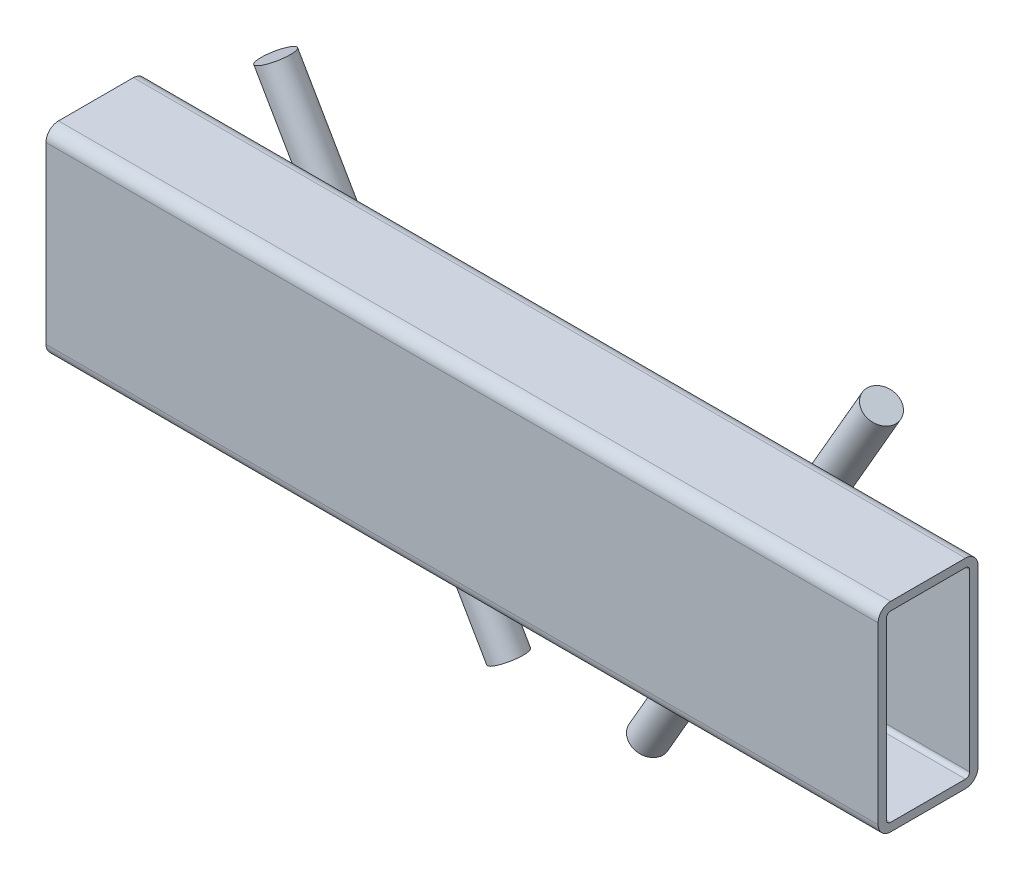
ISO-10303-21;
HEADER;
FILE_DESCRIPTION(('STEP AP214'),'2;1');
FILE_NAME('part.step','',(''),(''),'','','');
FILE_SCHEMA(('AUTOMOTIVE_DESIGN { 1 0 10303 214 1 1 1 1 }'));
ENDSEC;
DATA;
#1=APPLICATION_CONTEXT('core data for automotive mechanical design processes');
#2=APPLICATION_PROTOCOL_DEFINITION('international standard','automotive_design',2000,#1);
#3=PRODUCT_CONTEXT('',#1,'mechanical');
#4=PRODUCT('Part','Part','',(#3));
#5=PRODUCT_RELATED_PRODUCT_CATEGORY('part','',(#4));
#6=PRODUCT_DEFINITION_FORMATION('','',#4);
#7=PRODUCT_DEFINITION_CONTEXT('part definition',#1,'design');
#8=PRODUCT_DEFINITION('design','',#6,#7);
#9=PRODUCT_DEFINITION_SHAPE('','',#8);
#10=(LENGTH_UNIT() NAMED_UNIT(*) SI_UNIT(.MILLI.,.METRE.));
#11=(NAMED_UNIT(*) PLANE_ANGLE_UNIT() SI_UNIT($,.RADIAN.));
#12=(NAMED_UNIT(*) SI_UNIT($,.STERADIAN.) SOLID_ANGLE_UNIT());
#13=UNCERTAINTY_MEASURE_WITH_UNIT(LENGTH_MEASURE(1.E-05),#10,'distance_accuracy_value','');
#14=(GEOMETRIC_REPRESENTATION_CONTEXT(3) GLOBAL_UNCERTAINTY_ASSIGNED_CONTEXT((#13)) GLOBAL_UNIT_ASSIGNED_CONTEXT((#10,
#11,#12)) REPRESENTATION_CONTEXT('',''));
#15=CARTESIAN_POINT('',(0.,0.,0.));
#16=DIRECTION('',(0.,0.,1.));
#17=DIRECTION('',(1.,0.,0.));
#18=AXIS2_PLACEMENT_3D('',#15,#16,#17);
#19=CARTESIAN_POINT('',(21.,-73.,-20.));
#20=DIRECTION('',(0.5,0.86602540378444,0.));
#21=DIRECTION('',(0.86602540378444,-0.500000000000001,0.));
#22=AXIS2_PLACEMENT_3D('',#19,#20,#21);
#23=PLANE('',#22);
#24=CARTESIAN_POINT('',(21.,-73.,-20.));
#25=DIRECTION('',(-0.5,-0.86602540378444,0.));
#26=DIRECTION('',(0.86602540378444,-0.500000000000001,0.));
#27=AXIS2_PLACEMENT_3D('',#24,#25,#26);
#28=CIRCLE('',#27,5.);
#29=CARTESIAN_POINT('',(25.3301270189221,-75.5000000000001,-20.));
#30=VERTEX_POINT('',#29);
#31=EDGE_CURVE('E96',#30,#30,#28,.T.);
#32=ORIENTED_EDGE('',*,*,#31,.T.);
#33=EDGE_LOOP('',(#32));
#34=FACE_BOUND('',#33,.T.);
#35=ADVANCED_FACE('F89',(#34),#23,.F.);
#36=CARTESIAN_POINT('',(91.0000000000001,48.2435565298214,-20.));
#37=DIRECTION('',(0.5,0.86602540378444,0.));
#38=DIRECTION('',(0.86602540378444,-0.500000000000001,0.));
#39=AXIS2_PLACEMENT_3D('',#36,#37,#38);
#40=PLANE('',#39);
#41=CARTESIAN_POINT('',(91.0000000000001,48.2435565298214,-20.));
#42=DIRECTION('',(-0.5,-0.86602540378444,0.));
#43=DIRECTION('',(0.86602540378444,-0.500000000000001,0.));
#44=AXIS2_PLACEMENT_3D('',#41,#42,#43);
#45=CIRCLE('',#44,5.);
#46=CARTESIAN_POINT('',(95.3301270189223,45.7435565298214,-20.));
#47=VERTEX_POINT('',#46);
#48=EDGE_CURVE('E15',#47,#47,#45,.T.);
#49=ORIENTED_EDGE('',*,*,#48,.F.);
#50=EDGE_LOOP('',(#49));
#51=FACE_BOUND('',#50,.T.);
#52=ADVANCED_FACE('F106',(#51),#40,.T.);
#53=CARTESIAN_POINT('',(21.,-73.,-20.));
#54=DIRECTION('',(0.5,0.86602540378444,0.));
#55=DIRECTION('',(0.86602540378444,-0.500000000000001,0.));
#56=AXIS2_PLACEMENT_3D('',#53,#54,#55);
#57=CYLINDRICAL_SURFACE('',#56,5.);
#58=ORIENTED_EDGE('',*,*,#48,.T.);
#59=EDGE_LOOP('',(#58));
#60=FACE_BOUND('',#59,.T.);
#61=ORIENTED_EDGE('',*,*,#31,.F.);
#62=EDGE_LOOP('',(#61));
#63=FACE_BOUND('',#62,.T.);
#64=ADVANCED_FACE('F103',(#60,#63),#57,.T.);
#65=CLOSED_SHELL('',(#35,#52,#64));
#66=MANIFOLD_SOLID_BREP('B2',#65);
#67=CARTESIAN_POINT('',(-21.,-73.,-20.));
#68=DIRECTION('',(-0.500000000000001,0.86602540378444,0.));
#69=DIRECTION('',(-0.86602540378444,-0.5,0.));
#70=AXIS2_PLACEMENT_3D('',#67,#68,#69);
#71=PLANE('',#70);
#72=CARTESIAN_POINT('',(-21.,-73.,-20.));
#73=DIRECTION('',(-0.500000000000001,0.86602540378444,0.));
#74=DIRECTION('',(-0.86602540378444,-0.5,0.));
#75=AXIS2_PLACEMENT_3D('',#72,#73,#74);
#76=CIRCLE('',#75,5.);
#77=CARTESIAN_POINT('',(-25.3301270189222,-75.5000000000001,-20.));
#78=VERTEX_POINT('',#77);
#79=EDGE_CURVE('E149',#78,#78,#76,.T.);
#80=ORIENTED_EDGE('',*,*,#79,.F.);
#81=EDGE_LOOP('',(#80));
#82=FACE_BOUND('',#81,.T.);
#83=ADVANCED_FACE('F142',(#82),#71,.F.);
#84=CARTESIAN_POINT('',(-91.,48.2435565298214,-20.));
#85=DIRECTION('',(-0.500000000000001,0.86602540378444,0.));
#86=DIRECTION('',(-0.86602540378444,-0.5,0.));
#87=AXIS2_PLACEMENT_3D('',#84,#85,#86);
#88=PLANE('',#87);
#89=CARTESIAN_POINT('',(-91.,48.2435565298214,-20.));
#90=DIRECTION('',(-0.500000000000001,0.86602540378444,0.));
#91=DIRECTION('',(-0.86602540378444,-0.5,0.));
#92=AXIS2_PLACEMENT_3D('',#89,#90,#91);
#93=CIRCLE('',#92,5.);
#94=CARTESIAN_POINT('',(-95.3301270189222,45.7435565298214,-20.));
#95=VERTEX_POINT('',#94);
#96=EDGE_CURVE('E87',#95,#95,#93,.T.);
#97=ORIENTED_EDGE('',*,*,#96,.T.);
#98=EDGE_LOOP('',(#97));
#99=FACE_BOUND('',#98,.T.);
#100=ADVANCED_FACE('F156',(#99),#88,.T.);
#101=CARTESIAN_POINT('',(-21.,-73.,-20.));
#102=DIRECTION('',(-0.5,0.86602540378444,0.));
#103=DIRECTION('',(-0.86602540378444,-0.5,0.));
#104=AXIS2_PLACEMENT_3D('',#101,#102,#103);
#105=CYLINDRICAL_SURFACE('',#104,5.);
#106=ORIENTED_EDGE('',*,*,#96,.F.);
#107=EDGE_LOOP('',(#106));
#108=FACE_BOUND('',#107,.T.);
#109=ORIENTED_EDGE('',*,*,#79,.T.);
#110=EDGE_LOOP('',(#109));
#111=FACE_BOUND('',#110,.T.);
#112=ADVANCED_FACE('F158',(#108,#111),#105,.T.);
#113=CLOSED_SHELL('',(#83,#100,#112));
#114=MANIFOLD_SOLID_BREP('B9',#113);
#115=CARTESIAN_POINT('',(125.,26.2500000000001,-11.25));
#116=DIRECTION('',(-1.,0.,0.));
#117=DIRECTION('',(0.,0.,1.));
#118=AXIS2_PLACEMENT_3D('',#115,#116,#117);
#119=CYLINDRICAL_SURFACE('',#118,3.75);
#120=CARTESIAN_POINT('',(-125.,26.2500000000001,-11.25));
#121=DIRECTION('',(1.,0.,0.));
#122=DIRECTION('',(0.,0.,-1.));
#123=AXIS2_PLACEMENT_3D('',#120,#121,#122);
#124=CIRCLE('',#123,3.75);
#125=CARTESIAN_POINT('',(-125.,26.2500000000001,-15.));
#126=VERTEX_POINT('',#125);
#127=CARTESIAN_POINT('',(-125.,30.,-11.25));
#128=VERTEX_POINT('',#127);
#129=EDGE_CURVE('E356',#126,#128,#124,.T.);
#130=ORIENTED_EDGE('',*,*,#129,.T.);
#131=DIRECTION('',(-1.,0.,0.));
#132=VECTOR('',#131,1.);
#133=CARTESIAN_POINT('',(125.,30.,-11.25));
#134=LINE('',#133,#132);
#135=CARTESIAN_POINT('',(125.,30.,-11.25));
#136=VERTEX_POINT('',#135);
#137=EDGE_CURVE('E140',#136,#128,#134,.T.);
#138=ORIENTED_EDGE('',*,*,#137,.F.);
#139=CARTESIAN_POINT('',(125.,26.2500000000001,-11.25));
#140=DIRECTION('',(1.,0.,0.));
#141=DIRECTION('',(0.,0.,-1.));
#142=AXIS2_PLACEMENT_3D('',#139,#140,#141);
#143=CIRCLE('',#142,3.75);
#144=CARTESIAN_POINT('',(125.,26.2500000000001,-15.));
#145=VERTEX_POINT('',#144);
#146=EDGE_CURVE('E434',#145,#136,#143,.T.);
#147=ORIENTED_EDGE('',*,*,#146,.F.);
#148=DIRECTION('',(-1.,0.,0.));
#149=VECTOR('',#148,1.);
#150=CARTESIAN_POINT('',(125.,26.2500000000001,-15.));
#151=LINE('',#150,#149);
#152=EDGE_CURVE('E371',#145,#126,#151,.T.);
#153=ORIENTED_EDGE('',*,*,#152,.T.);
#154=EDGE_LOOP('',(#130,#138,#147,#153));
#155=FACE_BOUND('',#154,.T.);
#156=ADVANCED_FACE('F184',(#155),#119,.T.);
#157=CARTESIAN_POINT('',(125.,30.,-11.25));
#158=DIRECTION('',(0.,-1.,0.));
#159=DIRECTION('',(0.,0.,-1.));
#160=AXIS2_PLACEMENT_3D('',#157,#158,#159);
#161=PLANE('',#160);
#162=DIRECTION('',(0.,0.,1.));
#163=VECTOR('',#162,1.);
#164=CARTESIAN_POINT('',(-125.,30.,-11.25));
#165=LINE('',#164,#163);
#166=CARTESIAN_POINT('',(-125.,30.,11.25));
#167=VERTEX_POINT('',#166);
#168=EDGE_CURVE('E359',#128,#167,#165,.T.);
#169=ORIENTED_EDGE('',*,*,#168,.T.);
#170=DIRECTION('',(-1.,0.,0.));
#171=VECTOR('',#170,1.);
#172=CARTESIAN_POINT('',(125.,30.,11.25));
#173=LINE('',#172,#171);
#174=CARTESIAN_POINT('',(125.,30.,11.25));
#175=VERTEX_POINT('',#174);
#176=EDGE_CURVE('E194',#175,#167,#173,.T.);
#177=ORIENTED_EDGE('',*,*,#176,.F.);
#178=DIRECTION('',(0.,0.,1.));
#179=VECTOR('',#178,1.);
#180=CARTESIAN_POINT('',(125.,30.,-11.25));
#181=LINE('',#180,#179);
#182=EDGE_CURVE('E436',#136,#175,#181,.T.);
#183=ORIENTED_EDGE('',*,*,#182,.F.);
#184=ORIENTED_EDGE('',*,*,#137,.T.);
#185=EDGE_LOOP('',(#169,#177,#183,#184));
#186=FACE_BOUND('',#185,.T.);
#187=ADVANCED_FACE('F471',(#186),#161,.F.);
#188=CARTESIAN_POINT('',(125.,26.2500000000001,11.25));
#189=DIRECTION('',(-1.,0.,0.));
#190=DIRECTION('',(0.,0.,1.));
#191=AXIS2_PLACEMENT_3D('',#188,#189,#190);
#192=CYLINDRICAL_SURFACE('',#191,3.75);
#193=CARTESIAN_POINT('',(-125.,26.2500000000001,11.25));
#194=DIRECTION('',(1.,0.,0.));
#195=DIRECTION('',(0.,0.,-1.));
#196=AXIS2_PLACEMENT_3D('',#193,#194,#195);
#197=CIRCLE('',#196,3.75);
#198=CARTESIAN_POINT('',(-125.,26.2500000000001,15.));
#199=VERTEX_POINT('',#198);
#200=EDGE_CURVE('E361',#167,#199,#197,.T.);
#201=ORIENTED_EDGE('',*,*,#200,.T.);
#202=DIRECTION('',(-1.,0.,0.));
#203=VECTOR('',#202,1.);
#204=CARTESIAN_POINT('',(125.,26.2500000000001,15.));
#205=LINE('',#204,#203);
#206=CARTESIAN_POINT('',(125.,26.2500000000001,15.));
#207=VERTEX_POINT('',#206);
#208=EDGE_CURVE('E378',#207,#199,#205,.T.);
#209=ORIENTED_EDGE('',*,*,#208,.F.);
#210=CARTESIAN_POINT('',(125.,26.2500000000001,11.25));
#211=DIRECTION('',(1.,0.,0.));
#212=DIRECTION('',(0.,0.,-1.));
#213=AXIS2_PLACEMENT_3D('',#210,#211,#212);
#214=CIRCLE('',#213,3.75);
#215=EDGE_CURVE('E438',#175,#207,#214,.T.);
#216=ORIENTED_EDGE('',*,*,#215,.F.);
#217=ORIENTED_EDGE('',*,*,#176,.T.);
#218=EDGE_LOOP('',(#201,#209,#216,#217));
#219=FACE_BOUND('',#218,.T.);
#220=ADVANCED_FACE('F476',(#219),#192,.T.);
#221=CARTESIAN_POINT('',(125.,-26.2500000000001,15.));
#222=DIRECTION('',(0.,0.,-1.));
#223=DIRECTION('',(-1.,0.,0.));
#224=AXIS2_PLACEMENT_3D('',#221,#222,#223);
#225=PLANE('',#224);
#226=DIRECTION('',(0.,-1.,0.));
#227=VECTOR('',#226,1.);
#228=CARTESIAN_POINT('',(-125.,-26.2500000000001,15.));
#229=LINE('',#228,#227);
#230=CARTESIAN_POINT('',(-125.,-26.2500000000001,15.));
#231=VERTEX_POINT('',#230);
#232=EDGE_CURVE('E363',#199,#231,#229,.T.);
#233=ORIENTED_EDGE('',*,*,#232,.T.);
#234=DIRECTION('',(-1.,0.,0.));
#235=VECTOR('',#234,1.);
#236=CARTESIAN_POINT('',(125.,-26.2500000000001,15.));
#237=LINE('',#236,#235);
#238=CARTESIAN_POINT('',(125.,-26.2500000000001,15.));
#239=VERTEX_POINT('',#238);
#240=EDGE_CURVE('E375',#239,#231,#237,.T.);
#241=ORIENTED_EDGE('',*,*,#240,.F.);
#242=DIRECTION('',(0.,-1.,0.));
#243=VECTOR('',#242,1.);
#244=CARTESIAN_POINT('',(125.,-26.2500000000001,15.));
#245=LINE('',#244,#243);
#246=EDGE_CURVE('E440',#207,#239,#245,.T.);
#247=ORIENTED_EDGE('',*,*,#246,.F.);
#248=ORIENTED_EDGE('',*,*,#208,.T.);
#249=EDGE_LOOP('',(#233,#241,#247,#248));
#250=FACE_BOUND('',#249,.T.);
#251=ADVANCED_FACE('F446',(#250),#225,.F.);
#252=CARTESIAN_POINT('',(125.,-26.2500000000001,11.25));
#253=DIRECTION('',(-1.,0.,0.));
#254=DIRECTION('',(0.,0.,1.));
#255=AXIS2_PLACEMENT_3D('',#252,#253,#254);
#256=CYLINDRICAL_SURFACE('',#255,3.75);
#257=CARTESIAN_POINT('',(-125.,-26.2500000000001,11.25));
#258=DIRECTION('',(1.,0.,0.));
#259=DIRECTION('',(0.,0.,-1.));
#260=AXIS2_PLACEMENT_3D('',#257,#258,#259);
#261=CIRCLE('',#260,3.75);
#262=CARTESIAN_POINT('',(-125.,-30.,11.25));
#263=VERTEX_POINT('',#262);
#264=EDGE_CURVE('E365',#231,#263,#261,.T.);
#265=ORIENTED_EDGE('',*,*,#264,.T.);
#266=DIRECTION('',(-1.,0.,0.));
#267=VECTOR('',#266,1.);
#268=CARTESIAN_POINT('',(125.,-30.,11.25));
#269=LINE('',#268,#267);
#270=CARTESIAN_POINT('',(125.,-30.,11.25));
#271=VERTEX_POINT('',#270);
#272=EDGE_CURVE('E323',#271,#263,#269,.T.);
#273=ORIENTED_EDGE('',*,*,#272,.F.);
#274=CARTESIAN_POINT('',(125.,-26.2500000000001,11.25));
#275=DIRECTION('',(1.,0.,0.));
#276=DIRECTION('',(0.,0.,-1.));
#277=AXIS2_PLACEMENT_3D('',#274,#275,#276);
#278=CIRCLE('',#277,3.75);
#279=EDGE_CURVE('E314',#239,#271,#278,.T.);
#280=ORIENTED_EDGE('',*,*,#279,.F.);
#281=ORIENTED_EDGE('',*,*,#240,.T.);
#282=EDGE_LOOP('',(#265,#273,#280,#281));
#283=FACE_BOUND('',#282,.T.);
#284=ADVANCED_FACE('F450',(#283),#256,.T.);
#285=CARTESIAN_POINT('',(125.,-30.,11.25));
#286=DIRECTION('',(0.,1.,0.));
#287=DIRECTION('',(0.,0.,1.));
#288=AXIS2_PLACEMENT_3D('',#285,#286,#287);
#289=PLANE('',#288);
#290=DIRECTION('',(0.,0.,-1.));
#291=VECTOR('',#290,1.);
#292=CARTESIAN_POINT('',(-125.,-30.,11.25));
#293=LINE('',#292,#291);
#294=CARTESIAN_POINT('',(-125.,-30.,-11.25));
#295=VERTEX_POINT('',#294);
#296=EDGE_CURVE('E322',#263,#295,#293,.T.);
#297=ORIENTED_EDGE('',*,*,#296,.T.);
#298=DIRECTION('',(-1.,0.,0.));
#299=VECTOR('',#298,1.);
#300=CARTESIAN_POINT('',(125.,-30.,-11.25));
#301=LINE('',#300,#299);
#302=CARTESIAN_POINT('',(125.,-30.,-11.25));
#303=VERTEX_POINT('',#302);
#304=EDGE_CURVE('E319',#303,#295,#301,.T.);
#305=ORIENTED_EDGE('',*,*,#304,.F.);
#306=DIRECTION('',(0.,0.,-1.));
#307=VECTOR('',#306,1.);
#308=CARTESIAN_POINT('',(125.,-30.,11.25));
#309=LINE('',#308,#307);
#310=EDGE_CURVE('E308',#271,#303,#309,.T.);
#311=ORIENTED_EDGE('',*,*,#310,.F.);
#312=ORIENTED_EDGE('',*,*,#272,.T.);
#313=EDGE_LOOP('',(#297,#305,#311,#312));
#314=FACE_BOUND('',#313,.T.);
#315=ADVANCED_FACE('F320',(#314),#289,.F.);
#316=CARTESIAN_POINT('',(125.,-26.2500000000001,-11.25));
#317=DIRECTION('',(-1.,0.,0.));
#318=DIRECTION('',(0.,0.,1.));
#319=AXIS2_PLACEMENT_3D('',#316,#317,#318);
#320=CYLINDRICAL_SURFACE('',#319,3.75);
#321=CARTESIAN_POINT('',(-125.,-26.2500000000001,-11.25));
#322=DIRECTION('',(1.,0.,0.));
#323=DIRECTION('',(0.,0.,-1.));
#324=AXIS2_PLACEMENT_3D('',#321,#322,#323);
#325=CIRCLE('',#324,3.75);
#326=CARTESIAN_POINT('',(-125.,-26.2500000000001,-15.));
#327=VERTEX_POINT('',#326);
#328=EDGE_CURVE('E256',#295,#327,#325,.T.);
#329=ORIENTED_EDGE('',*,*,#328,.T.);
#330=DIRECTION('',(-1.,0.,0.));
#331=VECTOR('',#330,1.);
#332=CARTESIAN_POINT('',(125.,-26.2500000000001,-15.));
#333=LINE('',#332,#331);
#334=CARTESIAN_POINT('',(125.,-26.2500000000001,-15.));
#335=VERTEX_POINT('',#334);
#336=EDGE_CURVE('E324',#335,#327,#333,.T.);
#337=ORIENTED_EDGE('',*,*,#336,.F.);
#338=CARTESIAN_POINT('',(125.,-26.2500000000001,-11.25));
#339=DIRECTION('',(1.,0.,0.));
#340=DIRECTION('',(0.,0.,-1.));
#341=AXIS2_PLACEMENT_3D('',#338,#339,#340);
#342=CIRCLE('',#341,3.75);
#343=EDGE_CURVE('E312',#303,#335,#342,.T.);
#344=ORIENTED_EDGE('',*,*,#343,.F.);
#345=ORIENTED_EDGE('',*,*,#304,.T.);
#346=EDGE_LOOP('',(#329,#337,#344,#345));
#347=FACE_BOUND('',#346,.T.);
#348=ADVANCED_FACE('F326',(#347),#320,.T.);
#349=CARTESIAN_POINT('',(125.,26.2500000000001,11.25));
#350=DIRECTION('',(-1.,0.,0.));
#351=DIRECTION('',(0.,0.,1.));
#352=AXIS2_PLACEMENT_3D('',#349,#350,#351);
#353=CYLINDRICAL_SURFACE('',#352,1.25);
#354=CARTESIAN_POINT('',(-125.,26.2500000000001,11.25));
#355=DIRECTION('',(1.,0.,0.));
#356=DIRECTION('',(0.,0.,-1.));
#357=AXIS2_PLACEMENT_3D('',#354,#355,#356);
#358=CIRCLE('',#357,1.25);
#359=CARTESIAN_POINT('',(-125.,27.5000000000001,11.25));
#360=VERTEX_POINT('',#359);
#361=CARTESIAN_POINT('',(-125.,26.2500000000001,12.5));
#362=VERTEX_POINT('',#361);
#363=EDGE_CURVE('E332',#360,#362,#358,.T.);
#364=ORIENTED_EDGE('',*,*,#363,.F.);
#365=DIRECTION('',(-1.,0.,0.));
#366=VECTOR('',#365,1.);
#367=CARTESIAN_POINT('',(125.,27.5000000000001,11.25));
#368=LINE('',#367,#366);
#369=CARTESIAN_POINT('',(125.,27.5000000000001,11.25));
#370=VERTEX_POINT('',#369);
#371=EDGE_CURVE('E188',#370,#360,#368,.T.);
#372=ORIENTED_EDGE('',*,*,#371,.F.);
#373=CARTESIAN_POINT('',(125.,26.2500000000001,11.25));
#374=DIRECTION('',(1.,0.,0.));
#375=DIRECTION('',(0.,0.,-1.));
#376=AXIS2_PLACEMENT_3D('',#373,#374,#375);
#377=CIRCLE('',#376,1.25);
#378=CARTESIAN_POINT('',(125.,26.2500000000001,12.5));
#379=VERTEX_POINT('',#378);
#380=EDGE_CURVE('E370',#370,#379,#377,.T.);
#381=ORIENTED_EDGE('',*,*,#380,.T.);
#382=DIRECTION('',(-1.,0.,0.));
#383=VECTOR('',#382,1.);
#384=CARTESIAN_POINT('',(125.,26.2500000000001,12.5));
#385=LINE('',#384,#383);
#386=EDGE_CURVE('E328',#379,#362,#385,.T.);
#387=ORIENTED_EDGE('',*,*,#386,.T.);
#388=EDGE_LOOP('',(#364,#372,#381,#387));
#389=FACE_BOUND('',#388,.T.);
#390=ADVANCED_FACE('F186',(#389),#353,.F.);
#391=CARTESIAN_POINT('',(125.,27.5000000000001,-11.25));
#392=DIRECTION('',(0.,-1.,0.));
#393=DIRECTION('',(0.,0.,-1.));
#394=AXIS2_PLACEMENT_3D('',#391,#392,#393);
#395=PLANE('',#394);
#396=DIRECTION('',(0.,0.,1.));
#397=VECTOR('',#396,1.);
#398=CARTESIAN_POINT('',(-125.,27.5000000000001,-11.25));
#399=LINE('',#398,#397);
#400=CARTESIAN_POINT('',(-125.,27.5000000000001,-11.25));
#401=VERTEX_POINT('',#400);
#402=EDGE_CURVE('E335',#401,#360,#399,.T.);
#403=ORIENTED_EDGE('',*,*,#402,.F.);
#404=DIRECTION('',(-1.,0.,0.));
#405=VECTOR('',#404,1.);
#406=CARTESIAN_POINT('',(125.,27.5000000000001,-11.25));
#407=LINE('',#406,#405);
#408=CARTESIAN_POINT('',(125.,27.5000000000001,-11.25));
#409=VERTEX_POINT('',#408);
#410=EDGE_CURVE('E393',#409,#401,#407,.T.);
#411=ORIENTED_EDGE('',*,*,#410,.F.);
#412=DIRECTION('',(0.,0.,1.));
#413=VECTOR('',#412,1.);
#414=CARTESIAN_POINT('',(125.,27.5000000000001,-11.25));
#415=LINE('',#414,#413);
#416=EDGE_CURVE('E402',#409,#370,#415,.T.);
#417=ORIENTED_EDGE('',*,*,#416,.T.);
#418=ORIENTED_EDGE('',*,*,#371,.T.);
#419=EDGE_LOOP('',(#403,#411,#417,#418));
#420=FACE_BOUND('',#419,.T.);
#421=ADVANCED_FACE('F400',(#420),#395,.T.);
#422=CARTESIAN_POINT('',(125.,26.2500000000001,-11.25));
#423=DIRECTION('',(-1.,0.,0.));
#424=DIRECTION('',(0.,0.,1.));
#425=AXIS2_PLACEMENT_3D('',#422,#423,#424);
#426=CYLINDRICAL_SURFACE('',#425,1.25);
#427=CARTESIAN_POINT('',(-125.,26.2500000000001,-11.25));
#428=DIRECTION('',(1.,0.,0.));
#429=DIRECTION('',(0.,0.,-1.));
#430=AXIS2_PLACEMENT_3D('',#427,#428,#429);
#431=CIRCLE('',#430,1.25);
#432=CARTESIAN_POINT('',(-125.,26.2500000000001,-12.5));
#433=VERTEX_POINT('',#432);
#434=EDGE_CURVE('E338',#433,#401,#431,.T.);
#435=ORIENTED_EDGE('',*,*,#434,.F.);
#436=DIRECTION('',(-1.,0.,0.));
#437=VECTOR('',#436,1.);
#438=CARTESIAN_POINT('',(125.,26.2500000000001,-12.5));
#439=LINE('',#438,#437);
#440=CARTESIAN_POINT('',(125.,26.2500000000001,-12.5));
#441=VERTEX_POINT('',#440);
#442=EDGE_CURVE('E392',#441,#433,#439,.T.);
#443=ORIENTED_EDGE('',*,*,#442,.F.);
#444=CARTESIAN_POINT('',(125.,26.2500000000001,-11.25));
#445=DIRECTION('',(1.,0.,0.));
#446=DIRECTION('',(0.,0.,-1.));
#447=AXIS2_PLACEMENT_3D('',#444,#445,#446);
#448=CIRCLE('',#447,1.25);
#449=EDGE_CURVE('E410',#441,#409,#448,.T.);
#450=ORIENTED_EDGE('',*,*,#449,.T.);
#451=ORIENTED_EDGE('',*,*,#410,.T.);
#452=EDGE_LOOP('',(#435,#443,#450,#451));
#453=FACE_BOUND('',#452,.T.);
#454=ADVANCED_FACE('F408',(#453),#426,.F.);
#455=CARTESIAN_POINT('',(125.,26.2500000000001,-12.5));
#456=DIRECTION('',(0.,0.,1.));
#457=DIRECTION('',(1.,0.,0.));
#458=AXIS2_PLACEMENT_3D('',#455,#456,#457);
#459=PLANE('',#458);
#460=DIRECTION('',(0.,1.,0.));
#461=VECTOR('',#460,1.);
#462=CARTESIAN_POINT('',(-125.,26.2500000000001,-12.5));
#463=LINE('',#462,#461);
#464=CARTESIAN_POINT('',(-125.,-26.2500000000001,-12.5));
#465=VERTEX_POINT('',#464);
#466=EDGE_CURVE('E341',#465,#433,#463,.T.);
#467=ORIENTED_EDGE('',*,*,#466,.F.);
#468=DIRECTION('',(-1.,0.,0.));
#469=VECTOR('',#468,1.);
#470=CARTESIAN_POINT('',(125.,-26.2500000000001,-12.5));
#471=LINE('',#470,#469);
#472=CARTESIAN_POINT('',(125.,-26.2500000000001,-12.5));
#473=VERTEX_POINT('',#472);
#474=EDGE_CURVE('E390',#473,#465,#471,.T.);
#475=ORIENTED_EDGE('',*,*,#474,.F.);
#476=DIRECTION('',(0.,1.,0.));
#477=VECTOR('',#476,1.);
#478=CARTESIAN_POINT('',(125.,26.2500000000001,-12.5));
#479=LINE('',#478,#477);
#480=EDGE_CURVE('E416',#473,#441,#479,.T.);
#481=ORIENTED_EDGE('',*,*,#480,.T.);
#482=ORIENTED_EDGE('',*,*,#442,.T.);
#483=EDGE_LOOP('',(#467,#475,#481,#482));
#484=FACE_BOUND('',#483,.T.);
#485=ADVANCED_FACE('F419',(#484),#459,.T.);
#486=CARTESIAN_POINT('',(125.,-26.2500000000001,-11.25));
#487=DIRECTION('',(-1.,0.,0.));
#488=DIRECTION('',(0.,0.,1.));
#489=AXIS2_PLACEMENT_3D('',#486,#487,#488);
#490=CYLINDRICAL_SURFACE('',#489,1.25);
#491=CARTESIAN_POINT('',(-125.,-26.2500000000001,-11.25));
#492=DIRECTION('',(1.,0.,0.));
#493=DIRECTION('',(0.,0.,-1.));
#494=AXIS2_PLACEMENT_3D('',#491,#492,#493);
#495=CIRCLE('',#494,1.25);
#496=CARTESIAN_POINT('',(-125.,-27.5000000000001,-11.25));
#497=VERTEX_POINT('',#496);
#498=EDGE_CURVE('E344',#497,#465,#495,.T.);
#499=ORIENTED_EDGE('',*,*,#498,.F.);
#500=DIRECTION('',(-1.,0.,0.));
#501=VECTOR('',#500,1.);
#502=CARTESIAN_POINT('',(125.,-27.5000000000001,-11.25));
#503=LINE('',#502,#501);
#504=CARTESIAN_POINT('',(125.,-27.5000000000001,-11.25));
#505=VERTEX_POINT('',#504);
#506=EDGE_CURVE('E388',#505,#497,#503,.T.);
#507=ORIENTED_EDGE('',*,*,#506,.F.);
#508=CARTESIAN_POINT('',(125.,-26.2500000000001,-11.25));
#509=DIRECTION('',(1.,0.,0.));
#510=DIRECTION('',(0.,0.,-1.));
#511=AXIS2_PLACEMENT_3D('',#508,#509,#510);
#512=CIRCLE('',#511,1.25);
#513=EDGE_CURVE('E420',#505,#473,#512,.T.);
#514=ORIENTED_EDGE('',*,*,#513,.T.);
#515=ORIENTED_EDGE('',*,*,#474,.T.);
#516=EDGE_LOOP('',(#499,#507,#514,#515));
#517=FACE_BOUND('',#516,.T.);
#518=ADVANCED_FACE('F487',(#517),#490,.F.);
#519=CARTESIAN_POINT('',(125.,-27.5000000000001,11.25));
#520=DIRECTION('',(0.,1.,0.));
#521=DIRECTION('',(0.,0.,1.));
#522=AXIS2_PLACEMENT_3D('',#519,#520,#521);
#523=PLANE('',#522);
#524=DIRECTION('',(0.,0.,-1.));
#525=VECTOR('',#524,1.);
#526=CARTESIAN_POINT('',(-125.,-27.5000000000001,11.25));
#527=LINE('',#526,#525);
#528=CARTESIAN_POINT('',(-125.,-27.5000000000001,11.25));
#529=VERTEX_POINT('',#528);
#530=EDGE_CURVE('E347',#529,#497,#527,.T.);
#531=ORIENTED_EDGE('',*,*,#530,.F.);
#532=DIRECTION('',(-1.,0.,0.));
#533=VECTOR('',#532,1.);
#534=CARTESIAN_POINT('',(125.,-27.5000000000001,11.25));
#535=LINE('',#534,#533);
#536=CARTESIAN_POINT('',(125.,-27.5000000000001,11.25));
#537=VERTEX_POINT('',#536);
#538=EDGE_CURVE('E386',#537,#529,#535,.T.);
#539=ORIENTED_EDGE('',*,*,#538,.F.);
#540=DIRECTION('',(0.,0.,-1.));
#541=VECTOR('',#540,1.);
#542=CARTESIAN_POINT('',(125.,-27.5000000000001,11.25));
#543=LINE('',#542,#541);
#544=EDGE_CURVE('E422',#537,#505,#543,.T.);
#545=ORIENTED_EDGE('',*,*,#544,.T.);
#546=ORIENTED_EDGE('',*,*,#506,.T.);
#547=EDGE_LOOP('',(#531,#539,#545,#546));
#548=FACE_BOUND('',#547,.T.);
#549=ADVANCED_FACE('F483',(#548),#523,.T.);
#550=CARTESIAN_POINT('',(125.,-26.2500000000001,11.25));
#551=DIRECTION('',(-1.,0.,0.));
#552=DIRECTION('',(0.,0.,1.));
#553=AXIS2_PLACEMENT_3D('',#550,#551,#552);
#554=CYLINDRICAL_SURFACE('',#553,1.25);
#555=CARTESIAN_POINT('',(-125.,-26.2500000000001,11.25));
#556=DIRECTION('',(1.,0.,0.));
#557=DIRECTION('',(0.,0.,-1.));
#558=AXIS2_PLACEMENT_3D('',#555,#556,#557);
#559=CIRCLE('',#558,1.25);
#560=CARTESIAN_POINT('',(-125.,-26.2500000000001,12.5));
#561=VERTEX_POINT('',#560);
#562=EDGE_CURVE('E350',#561,#529,#559,.T.);
#563=ORIENTED_EDGE('',*,*,#562,.F.);
#564=DIRECTION('',(-1.,0.,0.));
#565=VECTOR('',#564,1.);
#566=CARTESIAN_POINT('',(125.,-26.2500000000001,12.5));
#567=LINE('',#566,#565);
#568=CARTESIAN_POINT('',(125.,-26.2500000000001,12.5));
#569=VERTEX_POINT('',#568);
#570=EDGE_CURVE('E384',#569,#561,#567,.T.);
#571=ORIENTED_EDGE('',*,*,#570,.F.);
#572=CARTESIAN_POINT('',(125.,-26.2500000000001,11.25));
#573=DIRECTION('',(1.,0.,0.));
#574=DIRECTION('',(0.,0.,-1.));
#575=AXIS2_PLACEMENT_3D('',#572,#573,#574);
#576=CIRCLE('',#575,1.25);
#577=EDGE_CURVE('E428',#569,#537,#576,.T.);
#578=ORIENTED_EDGE('',*,*,#577,.T.);
#579=ORIENTED_EDGE('',*,*,#538,.T.);
#580=EDGE_LOOP('',(#563,#571,#578,#579));
#581=FACE_BOUND('',#580,.T.);
#582=ADVANCED_FACE('F465',(#581),#554,.F.);
#583=CARTESIAN_POINT('',(125.,-26.2500000000001,12.5));
#584=DIRECTION('',(0.,0.,-1.));
#585=DIRECTION('',(-1.,0.,0.));
#586=AXIS2_PLACEMENT_3D('',#583,#584,#585);
#587=PLANE('',#586);
#588=DIRECTION('',(0.,-1.,0.));
#589=VECTOR('',#588,1.);
#590=CARTESIAN_POINT('',(-125.,-26.2500000000001,12.5));
#591=LINE('',#590,#589);
#592=EDGE_CURVE('E353',#362,#561,#591,.T.);
#593=ORIENTED_EDGE('',*,*,#592,.F.);
#594=ORIENTED_EDGE('',*,*,#386,.F.);
#595=DIRECTION('',(0.,-1.,0.));
#596=VECTOR('',#595,1.);
#597=CARTESIAN_POINT('',(125.,-26.2500000000001,12.5));
#598=LINE('',#597,#596);
#599=EDGE_CURVE('E431',#379,#569,#598,.T.);
#600=ORIENTED_EDGE('',*,*,#599,.T.);
#601=ORIENTED_EDGE('',*,*,#570,.T.);
#602=EDGE_LOOP('',(#593,#594,#600,#601));
#603=FACE_BOUND('',#602,.T.);
#604=ADVANCED_FACE('F458',(#603),#587,.T.);
#605=CARTESIAN_POINT('',(125.,26.2500000000001,-15.));
#606=DIRECTION('',(0.,0.,1.));
#607=DIRECTION('',(1.,0.,0.));
#608=AXIS2_PLACEMENT_3D('',#605,#606,#607);
#609=PLANE('',#608);
#610=DIRECTION('',(0.,1.,0.));
#611=VECTOR('',#610,1.);
#612=CARTESIAN_POINT('',(-125.,26.2500000000001,-15.));
#613=LINE('',#612,#611);
#614=EDGE_CURVE('E262',#327,#126,#613,.T.);
#615=ORIENTED_EDGE('',*,*,#614,.T.);
#616=ORIENTED_EDGE('',*,*,#152,.F.);
#617=DIRECTION('',(0.,1.,0.));
#618=VECTOR('',#617,1.);
#619=CARTESIAN_POINT('',(125.,26.2500000000001,-15.));
#620=LINE('',#619,#618);
#621=EDGE_CURVE('E203',#335,#145,#620,.T.);
#622=ORIENTED_EDGE('',*,*,#621,.F.);
#623=ORIENTED_EDGE('',*,*,#336,.T.);
#624=EDGE_LOOP('',(#615,#616,#622,#623));
#625=FACE_BOUND('',#624,.T.);
#626=ADVANCED_FACE('F456',(#625),#609,.F.);
#627=CARTESIAN_POINT('',(125.,26.2500000000001,-11.25));
#628=DIRECTION('',(1.,0.,0.));
#629=DIRECTION('',(0.,0.,-1.));
#630=AXIS2_PLACEMENT_3D('',#627,#628,#629);
#631=PLANE('',#630);
#632=ORIENTED_EDGE('',*,*,#380,.F.);
#633=ORIENTED_EDGE('',*,*,#416,.F.);
#634=ORIENTED_EDGE('',*,*,#449,.F.);
#635=ORIENTED_EDGE('',*,*,#480,.F.);
#636=ORIENTED_EDGE('',*,*,#513,.F.);
#637=ORIENTED_EDGE('',*,*,#544,.F.);
#638=ORIENTED_EDGE('',*,*,#577,.F.);
#639=ORIENTED_EDGE('',*,*,#599,.F.);
#640=EDGE_LOOP('',(#632,#633,#634,#635,#636,#637,#638,#639));
#641=FACE_BOUND('',#640,.T.);
#642=ORIENTED_EDGE('',*,*,#146,.T.);
#643=ORIENTED_EDGE('',*,*,#182,.T.);
#644=ORIENTED_EDGE('',*,*,#215,.T.);
#645=ORIENTED_EDGE('',*,*,#246,.T.);
#646=ORIENTED_EDGE('',*,*,#279,.T.);
#647=ORIENTED_EDGE('',*,*,#310,.T.);
#648=ORIENTED_EDGE('',*,*,#343,.T.);
#649=ORIENTED_EDGE('',*,*,#621,.T.);
#650=EDGE_LOOP('',(#642,#643,#644,#645,#646,#647,#648,#649));
#651=FACE_BOUND('',#650,.T.);
#652=ADVANCED_FACE('F310',(#641,#651),#631,.T.);
#653=CARTESIAN_POINT('',(-125.,26.2500000000001,-11.25));
#654=DIRECTION('',(1.,0.,0.));
#655=DIRECTION('',(0.,0.,-1.));
#656=AXIS2_PLACEMENT_3D('',#653,#654,#655);
#657=PLANE('',#656);
#658=ORIENTED_EDGE('',*,*,#363,.T.);
#659=ORIENTED_EDGE('',*,*,#592,.T.);
#660=ORIENTED_EDGE('',*,*,#562,.T.);
#661=ORIENTED_EDGE('',*,*,#530,.T.);
#662=ORIENTED_EDGE('',*,*,#498,.T.);
#663=ORIENTED_EDGE('',*,*,#466,.T.);
#664=ORIENTED_EDGE('',*,*,#434,.T.);
#665=ORIENTED_EDGE('',*,*,#402,.T.);
#666=EDGE_LOOP('',(#658,#659,#660,#661,#662,#663,#664,#665));
#667=FACE_BOUND('',#666,.T.);
#668=ORIENTED_EDGE('',*,*,#129,.F.);
#669=ORIENTED_EDGE('',*,*,#614,.F.);
#670=ORIENTED_EDGE('',*,*,#328,.F.);
#671=ORIENTED_EDGE('',*,*,#296,.F.);
#672=ORIENTED_EDGE('',*,*,#264,.F.);
#673=ORIENTED_EDGE('',*,*,#232,.F.);
#674=ORIENTED_EDGE('',*,*,#200,.F.);
#675=ORIENTED_EDGE('',*,*,#168,.F.);
#676=EDGE_LOOP('',(#668,#669,#670,#671,#672,#673,#674,#675));
#677=FACE_BOUND('',#676,.T.);
#678=ADVANCED_FACE('F405',(#667,#677),#657,.F.);
#679=CLOSED_SHELL('',(#156,#187,#220,#251,#284,#315,#348,#390,#421,#454,#485,#518,#549,#582,
#604,#626,#652,#678));
#680=MANIFOLD_SOLID_BREP('B81',#679);
#681=ADVANCED_BREP_SHAPE_REPRESENTATION('',(#18,#66,#114,#680),#14);
#682=SHAPE_DEFINITION_REPRESENTATION(#9,#681);
ENDSEC;
END-ISO-10303-21;
